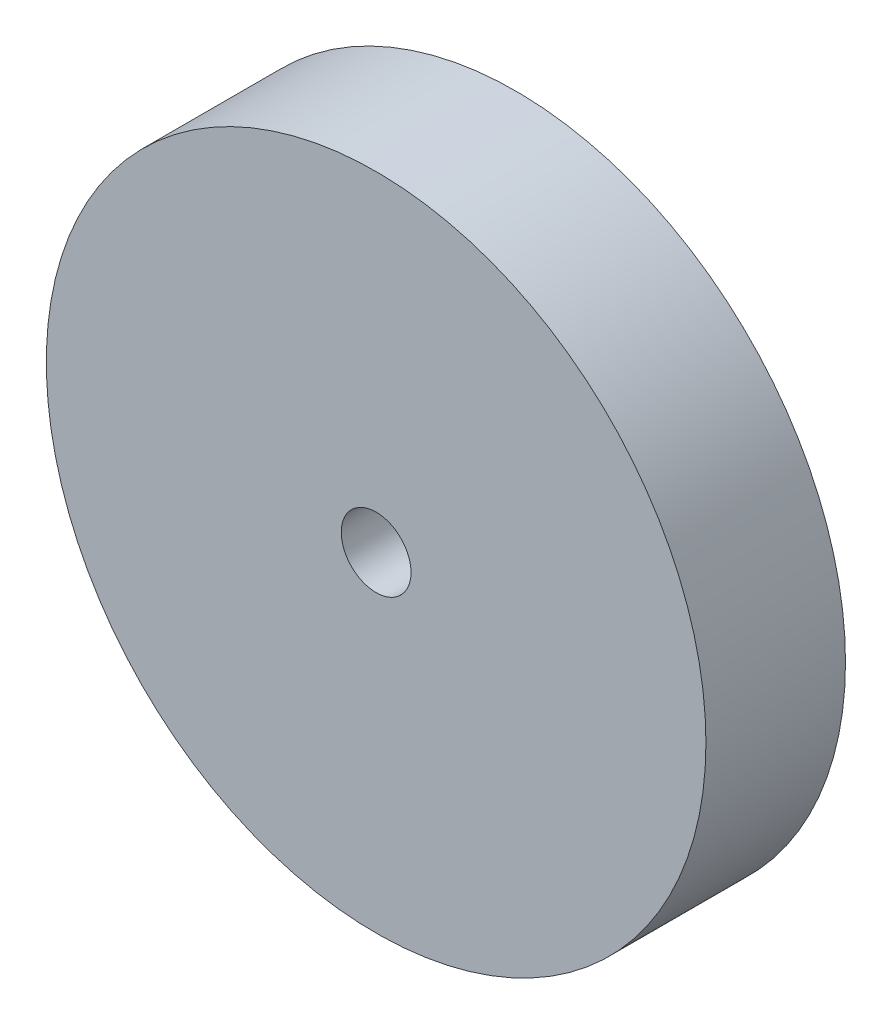
ISO-10303-21;
HEADER;
FILE_DESCRIPTION(('STEP AP214'),'2;1');
FILE_NAME('part.step','',(''),(''),'','','');
FILE_SCHEMA(('AUTOMOTIVE_DESIGN { 1 0 10303 214 1 1 1 1 }'));
ENDSEC;
DATA;
#1=APPLICATION_CONTEXT('core data for automotive mechanical design processes');
#2=APPLICATION_PROTOCOL_DEFINITION('international standard','automotive_design',2000,#1);
#3=PRODUCT_CONTEXT('',#1,'mechanical');
#4=PRODUCT('Part','Part','',(#3));
#5=PRODUCT_RELATED_PRODUCT_CATEGORY('part','',(#4));
#6=PRODUCT_DEFINITION_FORMATION('','',#4);
#7=PRODUCT_DEFINITION_CONTEXT('part definition',#1,'design');
#8=PRODUCT_DEFINITION('design','',#6,#7);
#9=PRODUCT_DEFINITION_SHAPE('','',#8);
#10=(LENGTH_UNIT() NAMED_UNIT(*) SI_UNIT(.MILLI.,.METRE.));
#11=(NAMED_UNIT(*) PLANE_ANGLE_UNIT() SI_UNIT($,.RADIAN.));
#12=(NAMED_UNIT(*) SI_UNIT($,.STERADIAN.) SOLID_ANGLE_UNIT());
#13=UNCERTAINTY_MEASURE_WITH_UNIT(LENGTH_MEASURE(1.E-05),#10,'distance_accuracy_value','');
#14=(GEOMETRIC_REPRESENTATION_CONTEXT(3) GLOBAL_UNCERTAINTY_ASSIGNED_CONTEXT((#13)) GLOBAL_UNIT_ASSIGNED_CONTEXT((#10,
#11,#12)) REPRESENTATION_CONTEXT('',''));
#15=CARTESIAN_POINT('',(0.,0.,0.));
#16=DIRECTION('',(0.,0.,1.));
#17=DIRECTION('',(1.,0.,0.));
#18=AXIS2_PLACEMENT_3D('',#15,#16,#17);
#19=CARTESIAN_POINT('',(0.,0.,4.));
#20=DIRECTION('',(0.,0.,-1.));
#21=DIRECTION('',(-1.,0.,0.));
#22=AXIS2_PLACEMENT_3D('',#19,#20,#21);
#23=CYLINDRICAL_SURFACE('',#22,9.45299319);
#24=CARTESIAN_POINT('',(0.,0.,4.));
#25=DIRECTION('',(0.,0.,1.));
#26=DIRECTION('',(1.,0.,0.));
#27=AXIS2_PLACEMENT_3D('',#24,#25,#26);
#28=CIRCLE('',#27,9.45299319);
#29=CARTESIAN_POINT('',(9.45299319,0.,4.));
#30=VERTEX_POINT('',#29);
#31=EDGE_CURVE('E10',#30,#30,#28,.T.);
#32=ORIENTED_EDGE('',*,*,#31,.F.);
#33=EDGE_LOOP('',(#32));
#34=FACE_BOUND('',#33,.T.);
#35=CARTESIAN_POINT('',(0.,0.,0.));
#36=DIRECTION('',(0.,0.,1.));
#37=DIRECTION('',(1.,0.,0.));
#38=AXIS2_PLACEMENT_3D('',#35,#36,#37);
#39=CIRCLE('',#38,9.45299319);
#40=CARTESIAN_POINT('',(9.45299319,0.,0.));
#41=VERTEX_POINT('',#40);
#42=EDGE_CURVE('E34',#41,#41,#39,.T.);
#43=ORIENTED_EDGE('',*,*,#42,.T.);
#44=EDGE_LOOP('',(#43));
#45=FACE_BOUND('',#44,.T.);
#46=ADVANCED_FACE('F31',(#34,#45),#23,.T.);
#47=CARTESIAN_POINT('',(0.,0.,4.));
#48=DIRECTION('',(0.,0.,1.));
#49=DIRECTION('',(1.,0.,0.));
#50=AXIS2_PLACEMENT_3D('',#47,#48,#49);
#51=PLANE('',#50);
#52=CARTESIAN_POINT('',(0.,0.,4.));
#53=DIRECTION('',(0.,0.,1.));
#54=DIRECTION('',(1.,0.,0.));
#55=AXIS2_PLACEMENT_3D('',#52,#53,#54);
#56=CIRCLE('',#55,1.);
#57=CARTESIAN_POINT('',(1.,0.,4.));
#58=VERTEX_POINT('',#57);
#59=EDGE_CURVE('E43',#58,#58,#56,.T.);
#60=ORIENTED_EDGE('',*,*,#59,.F.);
#61=EDGE_LOOP('',(#60));
#62=FACE_BOUND('',#61,.T.);
#63=ORIENTED_EDGE('',*,*,#31,.T.);
#64=EDGE_LOOP('',(#63));
#65=FACE_BOUND('',#64,.T.);
#66=ADVANCED_FACE('F58',(#62,#65),#51,.T.);
#67=CARTESIAN_POINT('',(0.,0.,0.));
#68=DIRECTION('',(0.,0.,1.));
#69=DIRECTION('',(1.,0.,0.));
#70=AXIS2_PLACEMENT_3D('',#67,#68,#69);
#71=PLANE('',#70);
#72=CARTESIAN_POINT('',(0.,0.,0.));
#73=DIRECTION('',(0.,0.,1.));
#74=DIRECTION('',(1.,0.,0.));
#75=AXIS2_PLACEMENT_3D('',#72,#73,#74);
#76=CIRCLE('',#75,1.);
#77=CARTESIAN_POINT('',(1.,0.,0.));
#78=VERTEX_POINT('',#77);
#79=EDGE_CURVE('E41',#78,#78,#76,.T.);
#80=ORIENTED_EDGE('',*,*,#79,.T.);
#81=EDGE_LOOP('',(#80));
#82=FACE_BOUND('',#81,.T.);
#83=ORIENTED_EDGE('',*,*,#42,.F.);
#84=EDGE_LOOP('',(#83));
#85=FACE_BOUND('',#84,.T.);
#86=ADVANCED_FACE('F49',(#82,#85),#71,.F.);
#87=CARTESIAN_POINT('',(0.,0.,0.));
#88=DIRECTION('',(0.,0.,1.));
#89=DIRECTION('',(1.,0.,0.));
#90=AXIS2_PLACEMENT_3D('',#87,#88,#89);
#91=CYLINDRICAL_SURFACE('',#90,1.);
#92=ORIENTED_EDGE('',*,*,#79,.F.);
#93=EDGE_LOOP('',(#92));
#94=FACE_BOUND('',#93,.T.);
#95=ORIENTED_EDGE('',*,*,#59,.T.);
#96=EDGE_LOOP('',(#95));
#97=FACE_BOUND('',#96,.T.);
#98=ADVANCED_FACE('F52',(#94,#97),#91,.F.);
#99=CLOSED_SHELL('',(#46,#66,#86,#98));
#100=MANIFOLD_SOLID_BREP('B2',#99);
#101=ADVANCED_BREP_SHAPE_REPRESENTATION('',(#18,#100),#14);
#102=SHAPE_DEFINITION_REPRESENTATION(#9,#101);
ENDSEC;
END-ISO-10303-21;
